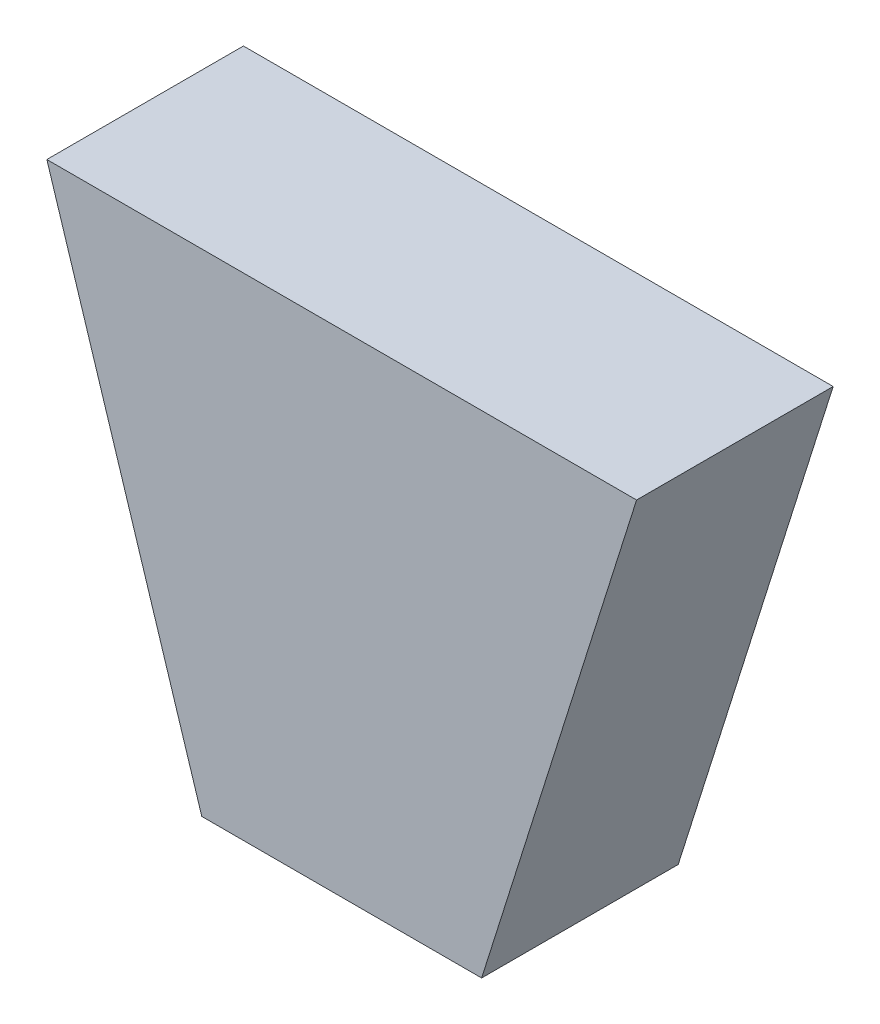
ISO-10303-21;
HEADER;
FILE_DESCRIPTION(('STEP AP214'),'2;1');
FILE_NAME('part.step','',(''),(''),'','','');
FILE_SCHEMA(('AUTOMOTIVE_DESIGN { 1 0 10303 214 1 1 1 1 }'));
ENDSEC;
DATA;
#1=APPLICATION_CONTEXT('core data for automotive mechanical design processes');
#2=APPLICATION_PROTOCOL_DEFINITION('international standard','automotive_design',2000,#1);
#3=PRODUCT_CONTEXT('',#1,'mechanical');
#4=PRODUCT('Part','Part','',(#3));
#5=PRODUCT_RELATED_PRODUCT_CATEGORY('part','',(#4));
#6=PRODUCT_DEFINITION_FORMATION('','',#4);
#7=PRODUCT_DEFINITION_CONTEXT('part definition',#1,'design');
#8=PRODUCT_DEFINITION('design','',#6,#7);
#9=PRODUCT_DEFINITION_SHAPE('','',#8);
#10=(LENGTH_UNIT() NAMED_UNIT(*) SI_UNIT(.MILLI.,.METRE.));
#11=(NAMED_UNIT(*) PLANE_ANGLE_UNIT() SI_UNIT($,.RADIAN.));
#12=(NAMED_UNIT(*) SI_UNIT($,.STERADIAN.) SOLID_ANGLE_UNIT());
#13=UNCERTAINTY_MEASURE_WITH_UNIT(LENGTH_MEASURE(1.E-05),#10,'distance_accuracy_value','');
#14=(GEOMETRIC_REPRESENTATION_CONTEXT(3) GLOBAL_UNCERTAINTY_ASSIGNED_CONTEXT((#13)) GLOBAL_UNIT_ASSIGNED_CONTEXT((#10,
#11,#12)) REPRESENTATION_CONTEXT('',''));
#15=CARTESIAN_POINT('',(0.,0.,0.));
#16=DIRECTION('',(0.,0.,1.));
#17=DIRECTION('',(1.,0.,0.));
#18=AXIS2_PLACEMENT_3D('',#15,#16,#17);
#19=CARTESIAN_POINT('',(0.,0.,20.));
#20=DIRECTION('',(0.,1.,0.));
#21=DIRECTION('',(-1.,0.,0.));
#22=AXIS2_PLACEMENT_3D('',#19,#20,#21);
#23=PLANE('',#22);
#24=DIRECTION('',(1.,0.,0.));
#25=VECTOR('',#24,1.);
#26=CARTESIAN_POINT('',(0.,0.,0.));
#27=LINE('',#26,#25);
#28=CARTESIAN_POINT('',(0.,0.,0.));
#29=VERTEX_POINT('',#28);
#30=CARTESIAN_POINT('',(28.4701211121016,0.,0.));
#31=VERTEX_POINT('',#30);
#32=EDGE_CURVE('E96',#29,#31,#27,.T.);
#33=ORIENTED_EDGE('',*,*,#32,.T.);
#34=DIRECTION('',(0.,0.,-1.));
#35=VECTOR('',#34,1.);
#36=CARTESIAN_POINT('',(28.4701211121016,0.,20.));
#37=LINE('',#36,#35);
#38=CARTESIAN_POINT('',(28.4701211121016,0.,20.));
#39=VERTEX_POINT('',#38);
#40=EDGE_CURVE('E11',#39,#31,#37,.T.);
#41=ORIENTED_EDGE('',*,*,#40,.F.);
#42=DIRECTION('',(1.,0.,0.));
#43=VECTOR('',#42,1.);
#44=CARTESIAN_POINT('',(0.,0.,20.));
#45=LINE('',#44,#43);
#46=CARTESIAN_POINT('',(0.,0.,20.));
#47=VERTEX_POINT('',#46);
#48=EDGE_CURVE('E84',#47,#39,#45,.T.);
#49=ORIENTED_EDGE('',*,*,#48,.F.);
#50=DIRECTION('',(0.,0.,-1.));
#51=VECTOR('',#50,1.);
#52=CARTESIAN_POINT('',(0.,0.,20.));
#53=LINE('',#52,#51);
#54=EDGE_CURVE('E92',#47,#29,#53,.T.);
#55=ORIENTED_EDGE('',*,*,#54,.T.);
#56=EDGE_LOOP('',(#33,#41,#49,#55));
#57=FACE_BOUND('',#56,.T.);
#58=ADVANCED_FACE('F33',(#57),#23,.F.);
#59=CARTESIAN_POINT('',(28.4701211121016,0.,20.));
#60=DIRECTION('',(-0.953716950748226,0.300705799504277,0.));
#61=DIRECTION('',(-0.300705799504277,-0.953716950748226,0.));
#62=AXIS2_PLACEMENT_3D('',#59,#60,#61);
#63=PLANE('',#62);
#64=DIRECTION('',(0.300705799504277,0.953716950748226,0.));
#65=VECTOR('',#64,1.);
#66=CARTESIAN_POINT('',(28.4701211121016,0.,0.));
#67=LINE('',#66,#65);
#68=CARTESIAN_POINT('',(44.235060556051,50.,0.));
#69=VERTEX_POINT('',#68);
#70=EDGE_CURVE('E88',#31,#69,#67,.T.);
#71=ORIENTED_EDGE('',*,*,#70,.T.);
#72=DIRECTION('',(0.,0.,-1.));
#73=VECTOR('',#72,1.);
#74=CARTESIAN_POINT('',(44.235060556051,50.,20.));
#75=LINE('',#74,#73);
#76=CARTESIAN_POINT('',(44.235060556051,50.,20.));
#77=VERTEX_POINT('',#76);
#78=EDGE_CURVE('E41',#77,#69,#75,.T.);
#79=ORIENTED_EDGE('',*,*,#78,.F.);
#80=DIRECTION('',(0.300705799504277,0.953716950748226,0.));
#81=VECTOR('',#80,1.);
#82=CARTESIAN_POINT('',(28.4701211121016,0.,20.));
#83=LINE('',#82,#81);
#84=EDGE_CURVE('E79',#39,#77,#83,.T.);
#85=ORIENTED_EDGE('',*,*,#84,.F.);
#86=ORIENTED_EDGE('',*,*,#40,.T.);
#87=EDGE_LOOP('',(#71,#79,#85,#86));
#88=FACE_BOUND('',#87,.T.);
#89=ADVANCED_FACE('F87',(#88),#63,.F.);
#90=CARTESIAN_POINT('',(44.235060556051,50.,20.));
#91=DIRECTION('',(0.,-1.,0.));
#92=DIRECTION('',(0.,0.,-1.));
#93=AXIS2_PLACEMENT_3D('',#90,#91,#92);
#94=PLANE('',#93);
#95=DIRECTION('',(-1.,0.,0.));
#96=VECTOR('',#95,1.);
#97=CARTESIAN_POINT('',(44.235060556051,50.,0.));
#98=LINE('',#97,#96);
#99=CARTESIAN_POINT('',(-15.764939443949,50.,0.));
#100=VERTEX_POINT('',#99);
#101=EDGE_CURVE('E66',#69,#100,#98,.T.);
#102=ORIENTED_EDGE('',*,*,#101,.T.);
#103=DIRECTION('',(0.,0.,-1.));
#104=VECTOR('',#103,1.);
#105=CARTESIAN_POINT('',(-15.764939443949,50.,20.));
#106=LINE('',#105,#104);
#107=CARTESIAN_POINT('',(-15.764939443949,50.,20.));
#108=VERTEX_POINT('',#107);
#109=EDGE_CURVE('E89',#108,#100,#106,.T.);
#110=ORIENTED_EDGE('',*,*,#109,.F.);
#111=DIRECTION('',(-1.,0.,0.));
#112=VECTOR('',#111,1.);
#113=CARTESIAN_POINT('',(44.235060556051,50.,20.));
#114=LINE('',#113,#112);
#115=EDGE_CURVE('E82',#77,#108,#114,.T.);
#116=ORIENTED_EDGE('',*,*,#115,.F.);
#117=ORIENTED_EDGE('',*,*,#78,.T.);
#118=EDGE_LOOP('',(#102,#110,#116,#117));
#119=FACE_BOUND('',#118,.T.);
#120=ADVANCED_FACE('F90',(#119),#94,.F.);
#121=CARTESIAN_POINT('',(0.,0.,20.));
#122=DIRECTION('',(0.953716950748228,0.300705799504271,0.));
#123=DIRECTION('',(-0.300705799504271,0.953716950748228,0.));
#124=AXIS2_PLACEMENT_3D('',#121,#122,#123);
#125=PLANE('',#124);
#126=DIRECTION('',(0.300705799504271,-0.953716950748228,0.));
#127=VECTOR('',#126,1.);
#128=CARTESIAN_POINT('',(0.,0.,0.));
#129=LINE('',#128,#127);
#130=EDGE_CURVE('E72',#100,#29,#129,.T.);
#131=ORIENTED_EDGE('',*,*,#130,.T.);
#132=ORIENTED_EDGE('',*,*,#54,.F.);
#133=DIRECTION('',(0.300705799504271,-0.953716950748228,0.));
#134=VECTOR('',#133,1.);
#135=CARTESIAN_POINT('',(0.,0.,20.));
#136=LINE('',#135,#134);
#137=EDGE_CURVE('E49',#108,#47,#136,.T.);
#138=ORIENTED_EDGE('',*,*,#137,.F.);
#139=ORIENTED_EDGE('',*,*,#109,.T.);
#140=EDGE_LOOP('',(#131,#132,#138,#139));
#141=FACE_BOUND('',#140,.T.);
#142=ADVANCED_FACE('F103',(#141),#125,.F.);
#143=CARTESIAN_POINT('',(0.,0.,20.));
#144=DIRECTION('',(0.,0.,1.));
#145=DIRECTION('',(1.,0.,0.));
#146=AXIS2_PLACEMENT_3D('',#143,#144,#145);
#147=PLANE('',#146);
#148=ORIENTED_EDGE('',*,*,#48,.T.);
#149=ORIENTED_EDGE('',*,*,#84,.T.);
#150=ORIENTED_EDGE('',*,*,#115,.T.);
#151=ORIENTED_EDGE('',*,*,#137,.T.);
#152=EDGE_LOOP('',(#148,#149,#150,#151));
#153=FACE_BOUND('',#152,.T.);
#154=ADVANCED_FACE('F80',(#153),#147,.T.);
#155=CARTESIAN_POINT('',(0.,0.,0.));
#156=DIRECTION('',(0.,0.,1.));
#157=DIRECTION('',(1.,0.,0.));
#158=AXIS2_PLACEMENT_3D('',#155,#156,#157);
#159=PLANE('',#158);
#160=ORIENTED_EDGE('',*,*,#32,.F.);
#161=ORIENTED_EDGE('',*,*,#130,.F.);
#162=ORIENTED_EDGE('',*,*,#101,.F.);
#163=ORIENTED_EDGE('',*,*,#70,.F.);
#164=EDGE_LOOP('',(#160,#161,#162,#163));
#165=FACE_BOUND('',#164,.T.);
#166=ADVANCED_FACE('F106',(#165),#159,.F.);
#167=CLOSED_SHELL('',(#58,#89,#120,#142,#154,#166));
#168=MANIFOLD_SOLID_BREP('B2',#167);
#169=ADVANCED_BREP_SHAPE_REPRESENTATION('',(#18,#168),#14);
#170=SHAPE_DEFINITION_REPRESENTATION(#9,#169);
ENDSEC;
END-ISO-10303-21;
